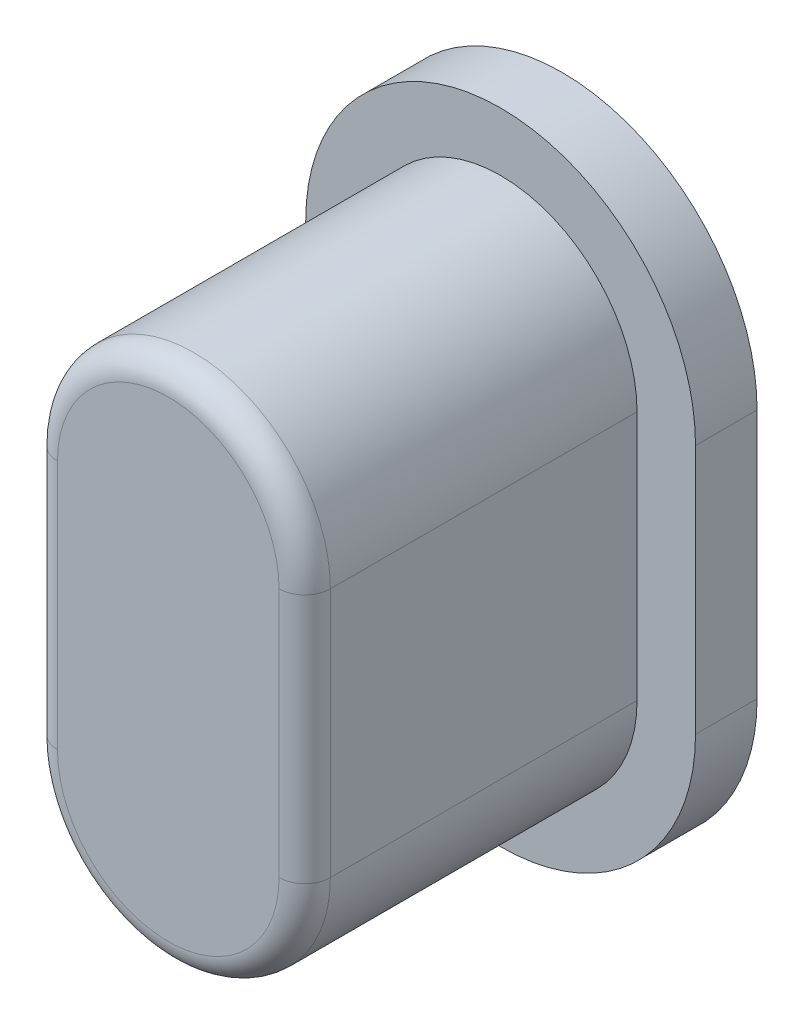
ISO-10303-21;
HEADER;
FILE_DESCRIPTION(('STEP AP214'),'2;1');
FILE_NAME('part.step','',(''),(''),'','','');
FILE_SCHEMA(('AUTOMOTIVE_DESIGN { 1 0 10303 214 1 1 1 1 }'));
ENDSEC;
DATA;
#1=APPLICATION_CONTEXT('core data for automotive mechanical design processes');
#2=APPLICATION_PROTOCOL_DEFINITION('international standard','automotive_design',2000,#1);
#3=PRODUCT_CONTEXT('',#1,'mechanical');
#4=PRODUCT('Part','Part','',(#3));
#5=PRODUCT_RELATED_PRODUCT_CATEGORY('part','',(#4));
#6=PRODUCT_DEFINITION_FORMATION('','',#4);
#7=PRODUCT_DEFINITION_CONTEXT('part definition',#1,'design');
#8=PRODUCT_DEFINITION('design','',#6,#7);
#9=PRODUCT_DEFINITION_SHAPE('','',#8);
#10=(LENGTH_UNIT() NAMED_UNIT(*) SI_UNIT(.MILLI.,.METRE.));
#11=(NAMED_UNIT(*) PLANE_ANGLE_UNIT() SI_UNIT($,.RADIAN.));
#12=(NAMED_UNIT(*) SI_UNIT($,.STERADIAN.) SOLID_ANGLE_UNIT());
#13=UNCERTAINTY_MEASURE_WITH_UNIT(LENGTH_MEASURE(1.E-05),#10,'distance_accuracy_value','');
#14=(GEOMETRIC_REPRESENTATION_CONTEXT(3) GLOBAL_UNCERTAINTY_ASSIGNED_CONTEXT((#13)) GLOBAL_UNIT_ASSIGNED_CONTEXT((#10,
#11,#12)) REPRESENTATION_CONTEXT('',''));
#15=CARTESIAN_POINT('',(0.,0.,0.));
#16=DIRECTION('',(0.,0.,1.));
#17=DIRECTION('',(1.,0.,0.));
#18=AXIS2_PLACEMENT_3D('',#15,#16,#17);
#19=CARTESIAN_POINT('',(0.,-2.43766,1.2));
#20=DIRECTION('',(0.,0.,1.));
#21=DIRECTION('',(1.,0.,0.));
#22=AXIS2_PLACEMENT_3D('',#19,#20,#21);
#23=PLANE('',#22);
#24=CARTESIAN_POINT('',(0.,-2.43766,1.2));
#25=DIRECTION('',(0.,0.,1.));
#26=DIRECTION('',(1.,0.,0.));
#27=AXIS2_PLACEMENT_3D('',#24,#25,#26);
#28=CIRCLE('',#27,3.8);
#29=CARTESIAN_POINT('',(-3.8,-2.43766,1.2));
#30=VERTEX_POINT('',#29);
#31=CARTESIAN_POINT('',(3.8,-2.43766,1.2));
#32=VERTEX_POINT('',#31);
#33=EDGE_CURVE('E140',#30,#32,#28,.T.);
#34=ORIENTED_EDGE('',*,*,#33,.T.);
#35=DIRECTION('',(0.,1.,0.));
#36=VECTOR('',#35,1.);
#37=CARTESIAN_POINT('',(3.8,-2.43766,1.2));
#38=LINE('',#37,#36);
#39=CARTESIAN_POINT('',(3.8,2.43766,1.2));
#40=VERTEX_POINT('',#39);
#41=EDGE_CURVE('E143',#32,#40,#38,.T.);
#42=ORIENTED_EDGE('',*,*,#41,.T.);
#43=CARTESIAN_POINT('',(0.,2.43766,1.2));
#44=DIRECTION('',(0.,0.,1.));
#45=DIRECTION('',(1.,0.,0.));
#46=AXIS2_PLACEMENT_3D('',#43,#44,#45);
#47=CIRCLE('',#46,3.8);
#48=CARTESIAN_POINT('',(-3.8,2.43766,1.2));
#49=VERTEX_POINT('',#48);
#50=EDGE_CURVE('E146',#40,#49,#47,.T.);
#51=ORIENTED_EDGE('',*,*,#50,.T.);
#52=DIRECTION('',(0.,-1.,0.));
#53=VECTOR('',#52,1.);
#54=CARTESIAN_POINT('',(-3.8,-2.43766,1.2));
#55=LINE('',#54,#53);
#56=EDGE_CURVE('E148',#49,#30,#55,.T.);
#57=ORIENTED_EDGE('',*,*,#56,.T.);
#58=EDGE_LOOP('',(#34,#42,#51,#57));
#59=FACE_BOUND('',#58,.T.);
#60=DIRECTION('',(0.,1.,0.));
#61=VECTOR('',#60,1.);
#62=CARTESIAN_POINT('',(2.66,-2.43766,1.2));
#63=LINE('',#62,#61);
#64=CARTESIAN_POINT('',(2.66,-2.43766,1.2));
#65=VERTEX_POINT('',#64);
#66=CARTESIAN_POINT('',(2.66,2.43766,1.2));
#67=VERTEX_POINT('',#66);
#68=EDGE_CURVE('E113',#65,#67,#63,.T.);
#69=ORIENTED_EDGE('',*,*,#68,.F.);
#70=CARTESIAN_POINT('',(0.,-2.43766,1.2));
#71=DIRECTION('',(0.,0.,1.));
#72=DIRECTION('',(1.,0.,0.));
#73=AXIS2_PLACEMENT_3D('',#70,#71,#72);
#74=CIRCLE('',#73,2.66);
#75=CARTESIAN_POINT('',(-2.66,-2.43766,1.2));
#76=VERTEX_POINT('',#75);
#77=EDGE_CURVE('E121',#76,#65,#74,.T.);
#78=ORIENTED_EDGE('',*,*,#77,.F.);
#79=DIRECTION('',(0.,-1.,0.));
#80=VECTOR('',#79,1.);
#81=CARTESIAN_POINT('',(-2.66,2.43766,1.2));
#82=LINE('',#81,#80);
#83=CARTESIAN_POINT('',(-2.66,2.43766,1.2));
#84=VERTEX_POINT('',#83);
#85=EDGE_CURVE('E132',#84,#76,#82,.T.);
#86=ORIENTED_EDGE('',*,*,#85,.F.);
#87=CARTESIAN_POINT('',(0.,2.43766,1.2));
#88=DIRECTION('',(0.,0.,1.));
#89=DIRECTION('',(1.,0.,0.));
#90=AXIS2_PLACEMENT_3D('',#87,#88,#89);
#91=CIRCLE('',#90,2.66);
#92=EDGE_CURVE('E130',#67,#84,#91,.T.);
#93=ORIENTED_EDGE('',*,*,#92,.F.);
#94=EDGE_LOOP('',(#69,#78,#86,#93));
#95=FACE_BOUND('',#94,.T.);
#96=ADVANCED_FACE('F33',(#59,#95),#23,.T.);
#97=CARTESIAN_POINT('',(0.,-2.43766,1.2));
#98=DIRECTION('',(0.,0.,-1.));
#99=DIRECTION('',(-1.,0.,0.));
#100=AXIS2_PLACEMENT_3D('',#97,#98,#99);
#101=CYLINDRICAL_SURFACE('',#100,3.8);
#102=CARTESIAN_POINT('',(0.,-2.43766,0.));
#103=DIRECTION('',(0.,0.,1.));
#104=DIRECTION('',(1.,0.,0.));
#105=AXIS2_PLACEMENT_3D('',#102,#103,#104);
#106=CIRCLE('',#105,3.8);
#107=CARTESIAN_POINT('',(-3.8,-2.43766,0.));
#108=VERTEX_POINT('',#107);
#109=CARTESIAN_POINT('',(3.8,-2.43766,0.));
#110=VERTEX_POINT('',#109);
#111=EDGE_CURVE('E117',#108,#110,#106,.T.);
#112=ORIENTED_EDGE('',*,*,#111,.T.);
#113=DIRECTION('',(0.,0.,-1.));
#114=VECTOR('',#113,1.);
#115=CARTESIAN_POINT('',(3.8,-2.43766,1.2));
#116=LINE('',#115,#114);
#117=EDGE_CURVE('E166',#32,#110,#116,.T.);
#118=ORIENTED_EDGE('',*,*,#117,.F.);
#119=ORIENTED_EDGE('',*,*,#33,.F.);
#120=DIRECTION('',(0.,0.,-1.));
#121=VECTOR('',#120,1.);
#122=CARTESIAN_POINT('',(-3.8,-2.43766,1.2));
#123=LINE('',#122,#121);
#124=EDGE_CURVE('E150',#30,#108,#123,.T.);
#125=ORIENTED_EDGE('',*,*,#124,.T.);
#126=EDGE_LOOP('',(#112,#118,#119,#125));
#127=FACE_BOUND('',#126,.T.);
#128=ADVANCED_FACE('F218',(#127),#101,.T.);
#129=CARTESIAN_POINT('',(3.8,-2.43766,1.2));
#130=DIRECTION('',(-1.,0.,0.));
#131=DIRECTION('',(0.,-1.,0.));
#132=AXIS2_PLACEMENT_3D('',#129,#130,#131);
#133=PLANE('',#132);
#134=DIRECTION('',(0.,1.,0.));
#135=VECTOR('',#134,1.);
#136=CARTESIAN_POINT('',(3.8,-2.43766,0.));
#137=LINE('',#136,#135);
#138=CARTESIAN_POINT('',(3.8,2.43766,0.));
#139=VERTEX_POINT('',#138);
#140=EDGE_CURVE('E153',#110,#139,#137,.T.);
#141=ORIENTED_EDGE('',*,*,#140,.T.);
#142=DIRECTION('',(0.,0.,-1.));
#143=VECTOR('',#142,1.);
#144=CARTESIAN_POINT('',(3.8,2.43766,1.2));
#145=LINE('',#144,#143);
#146=EDGE_CURVE('E163',#40,#139,#145,.T.);
#147=ORIENTED_EDGE('',*,*,#146,.F.);
#148=ORIENTED_EDGE('',*,*,#41,.F.);
#149=ORIENTED_EDGE('',*,*,#117,.T.);
#150=EDGE_LOOP('',(#141,#147,#148,#149));
#151=FACE_BOUND('',#150,.T.);
#152=ADVANCED_FACE('F224',(#151),#133,.F.);
#153=CARTESIAN_POINT('',(0.,2.43766,1.2));
#154=DIRECTION('',(0.,0.,-1.));
#155=DIRECTION('',(-1.,0.,0.));
#156=AXIS2_PLACEMENT_3D('',#153,#154,#155);
#157=CYLINDRICAL_SURFACE('',#156,3.8);
#158=CARTESIAN_POINT('',(0.,2.43766,0.));
#159=DIRECTION('',(0.,0.,1.));
#160=DIRECTION('',(1.,0.,0.));
#161=AXIS2_PLACEMENT_3D('',#158,#159,#160);
#162=CIRCLE('',#161,3.8);
#163=CARTESIAN_POINT('',(-3.8,2.43766,0.));
#164=VERTEX_POINT('',#163);
#165=EDGE_CURVE('E155',#139,#164,#162,.T.);
#166=ORIENTED_EDGE('',*,*,#165,.T.);
#167=DIRECTION('',(0.,0.,-1.));
#168=VECTOR('',#167,1.);
#169=CARTESIAN_POINT('',(-3.8,2.43766,1.2));
#170=LINE('',#169,#168);
#171=EDGE_CURVE('E160',#49,#164,#170,.T.);
#172=ORIENTED_EDGE('',*,*,#171,.F.);
#173=ORIENTED_EDGE('',*,*,#50,.F.);
#174=ORIENTED_EDGE('',*,*,#146,.T.);
#175=EDGE_LOOP('',(#166,#172,#173,#174));
#176=FACE_BOUND('',#175,.T.);
#177=ADVANCED_FACE('F237',(#176),#157,.T.);
#178=CARTESIAN_POINT('',(-3.8,-2.43766,1.2));
#179=DIRECTION('',(1.,0.,0.));
#180=DIRECTION('',(0.,1.,0.));
#181=AXIS2_PLACEMENT_3D('',#178,#179,#180);
#182=PLANE('',#181);
#183=DIRECTION('',(0.,-1.,0.));
#184=VECTOR('',#183,1.);
#185=CARTESIAN_POINT('',(-3.8,-2.43766,0.));
#186=LINE('',#185,#184);
#187=EDGE_CURVE('E144',#164,#108,#186,.T.);
#188=ORIENTED_EDGE('',*,*,#187,.T.);
#189=ORIENTED_EDGE('',*,*,#124,.F.);
#190=ORIENTED_EDGE('',*,*,#56,.F.);
#191=ORIENTED_EDGE('',*,*,#171,.T.);
#192=EDGE_LOOP('',(#188,#189,#190,#191));
#193=FACE_BOUND('',#192,.T.);
#194=ADVANCED_FACE('F233',(#193),#182,.F.);
#195=CARTESIAN_POINT('',(0.,-2.43766,0.));
#196=DIRECTION('',(0.,0.,1.));
#197=DIRECTION('',(1.,0.,0.));
#198=AXIS2_PLACEMENT_3D('',#195,#196,#197);
#199=PLANE('',#198);
#200=ORIENTED_EDGE('',*,*,#111,.F.);
#201=ORIENTED_EDGE('',*,*,#187,.F.);
#202=ORIENTED_EDGE('',*,*,#165,.F.);
#203=ORIENTED_EDGE('',*,*,#140,.F.);
#204=EDGE_LOOP('',(#200,#201,#202,#203));
#205=FACE_BOUND('',#204,.T.);
#206=ADVANCED_FACE('F230',(#205),#199,.F.);
#207=CARTESIAN_POINT('',(0.,-2.43766,7.68));
#208=DIRECTION('',(0.,0.,-1.));
#209=DIRECTION('',(-1.,0.,0.));
#210=AXIS2_PLACEMENT_3D('',#207,#208,#209);
#211=CYLINDRICAL_SURFACE('',#210,2.66);
#212=DIRECTION('',(0.,0.,-1.));
#213=VECTOR('',#212,1.);
#214=CARTESIAN_POINT('',(2.66,-2.43766,7.68));
#215=LINE('',#214,#213);
#216=CARTESIAN_POINT('',(2.66,-2.43766,7.18));
#217=VERTEX_POINT('',#216);
#218=EDGE_CURVE('E109',#217,#65,#215,.T.);
#219=ORIENTED_EDGE('',*,*,#218,.F.);
#220=CARTESIAN_POINT('',(0.,-2.43766,7.18));
#221=DIRECTION('',(0.,0.,1.));
#222=DIRECTION('',(1.,0.,0.));
#223=AXIS2_PLACEMENT_3D('',#220,#221,#222);
#224=CIRCLE('',#223,2.66);
#225=CARTESIAN_POINT('',(-2.66,-2.43766,7.18));
#226=VERTEX_POINT('',#225);
#227=EDGE_CURVE('E11',#217,#226,#224,.F.);
#228=ORIENTED_EDGE('',*,*,#227,.T.);
#229=DIRECTION('',(0.,0.,-1.));
#230=VECTOR('',#229,1.);
#231=CARTESIAN_POINT('',(-2.66,-2.43766,7.68));
#232=LINE('',#231,#230);
#233=EDGE_CURVE('E124',#226,#76,#232,.T.);
#234=ORIENTED_EDGE('',*,*,#233,.T.);
#235=ORIENTED_EDGE('',*,*,#77,.T.);
#236=EDGE_LOOP('',(#219,#228,#234,#235));
#237=FACE_BOUND('',#236,.T.);
#238=ADVANCED_FACE('F122',(#237),#211,.T.);
#239=CARTESIAN_POINT('',(2.66,-2.43766,7.68));
#240=DIRECTION('',(-1.,0.,0.));
#241=DIRECTION('',(0.,0.,1.));
#242=AXIS2_PLACEMENT_3D('',#239,#240,#241);
#243=PLANE('',#242);
#244=DIRECTION('',(0.,0.,-1.));
#245=VECTOR('',#244,1.);
#246=CARTESIAN_POINT('',(2.66,2.43766,7.68));
#247=LINE('',#246,#245);
#248=CARTESIAN_POINT('',(2.66,2.43766,7.18));
#249=VERTEX_POINT('',#248);
#250=EDGE_CURVE('E118',#249,#67,#247,.T.);
#251=ORIENTED_EDGE('',*,*,#250,.F.);
#252=DIRECTION('',(0.,1.,0.));
#253=VECTOR('',#252,1.);
#254=CARTESIAN_POINT('',(2.66,-2.43766,7.18));
#255=LINE('',#254,#253);
#256=EDGE_CURVE('E42',#249,#217,#255,.F.);
#257=ORIENTED_EDGE('',*,*,#256,.T.);
#258=ORIENTED_EDGE('',*,*,#218,.T.);
#259=ORIENTED_EDGE('',*,*,#68,.T.);
#260=EDGE_LOOP('',(#251,#257,#258,#259));
#261=FACE_BOUND('',#260,.T.);
#262=ADVANCED_FACE('F111',(#261),#243,.F.);
#263=CARTESIAN_POINT('',(0.,2.43766,7.68));
#264=DIRECTION('',(0.,0.,-1.));
#265=DIRECTION('',(-1.,0.,0.));
#266=AXIS2_PLACEMENT_3D('',#263,#264,#265);
#267=CYLINDRICAL_SURFACE('',#266,2.66);
#268=DIRECTION('',(0.,0.,-1.));
#269=VECTOR('',#268,1.);
#270=CARTESIAN_POINT('',(-2.66,2.43766,7.68));
#271=LINE('',#270,#269);
#272=CARTESIAN_POINT('',(-2.66,2.43766,7.18));
#273=VERTEX_POINT('',#272);
#274=EDGE_CURVE('E137',#273,#84,#271,.T.);
#275=ORIENTED_EDGE('',*,*,#274,.F.);
#276=CARTESIAN_POINT('',(0.,2.43766,7.18));
#277=DIRECTION('',(0.,0.,1.));
#278=DIRECTION('',(1.,0.,0.));
#279=AXIS2_PLACEMENT_3D('',#276,#277,#278);
#280=CIRCLE('',#279,2.66);
#281=EDGE_CURVE('E57',#273,#249,#280,.F.);
#282=ORIENTED_EDGE('',*,*,#281,.T.);
#283=ORIENTED_EDGE('',*,*,#250,.T.);
#284=ORIENTED_EDGE('',*,*,#92,.T.);
#285=EDGE_LOOP('',(#275,#282,#283,#284));
#286=FACE_BOUND('',#285,.T.);
#287=ADVANCED_FACE('F215',(#286),#267,.T.);
#288=CARTESIAN_POINT('',(-2.66,2.43766,7.68));
#289=DIRECTION('',(1.,0.,0.));
#290=DIRECTION('',(0.,1.,0.));
#291=AXIS2_PLACEMENT_3D('',#288,#289,#290);
#292=PLANE('',#291);
#293=ORIENTED_EDGE('',*,*,#233,.F.);
#294=DIRECTION('',(0.,-1.,0.));
#295=VECTOR('',#294,1.);
#296=CARTESIAN_POINT('',(-2.66,2.43766,7.18));
#297=LINE('',#296,#295);
#298=EDGE_CURVE('E178',#226,#273,#297,.F.);
#299=ORIENTED_EDGE('',*,*,#298,.T.);
#300=ORIENTED_EDGE('',*,*,#274,.T.);
#301=ORIENTED_EDGE('',*,*,#85,.T.);
#302=EDGE_LOOP('',(#293,#299,#300,#301));
#303=FACE_BOUND('',#302,.T.);
#304=ADVANCED_FACE('F203',(#303),#292,.F.);
#305=CARTESIAN_POINT('',(0.,-2.43766,7.68));
#306=DIRECTION('',(0.,0.,1.));
#307=DIRECTION('',(1.,0.,0.));
#308=AXIS2_PLACEMENT_3D('',#305,#306,#307);
#309=PLANE('',#308);
#310=CARTESIAN_POINT('',(0.,2.43766,7.68));
#311=DIRECTION('',(0.,0.,1.));
#312=DIRECTION('',(1.,0.,0.));
#313=AXIS2_PLACEMENT_3D('',#310,#311,#312);
#314=CIRCLE('',#313,2.16);
#315=CARTESIAN_POINT('',(2.16,2.43766,7.68));
#316=VERTEX_POINT('',#315);
#317=CARTESIAN_POINT('',(-2.16,2.43766,7.68));
#318=VERTEX_POINT('',#317);
#319=EDGE_CURVE('E173',#316,#318,#314,.T.);
#320=ORIENTED_EDGE('',*,*,#319,.T.);
#321=DIRECTION('',(0.,-1.,0.));
#322=VECTOR('',#321,1.);
#323=CARTESIAN_POINT('',(-2.16,-2.43766,7.68));
#324=LINE('',#323,#322);
#325=CARTESIAN_POINT('',(-2.16,-2.43766,7.68));
#326=VERTEX_POINT('',#325);
#327=EDGE_CURVE('E175',#318,#326,#324,.T.);
#328=ORIENTED_EDGE('',*,*,#327,.T.);
#329=CARTESIAN_POINT('',(0.,-2.43766,7.68));
#330=DIRECTION('',(0.,0.,1.));
#331=DIRECTION('',(1.,0.,0.));
#332=AXIS2_PLACEMENT_3D('',#329,#330,#331);
#333=CIRCLE('',#332,2.16);
#334=CARTESIAN_POINT('',(2.16,-2.43766,7.68));
#335=VERTEX_POINT('',#334);
#336=EDGE_CURVE('E169',#326,#335,#333,.T.);
#337=ORIENTED_EDGE('',*,*,#336,.T.);
#338=DIRECTION('',(0.,1.,0.));
#339=VECTOR('',#338,1.);
#340=CARTESIAN_POINT('',(2.16,2.43766,7.68));
#341=LINE('',#340,#339);
#342=EDGE_CURVE('E171',#335,#316,#341,.T.);
#343=ORIENTED_EDGE('',*,*,#342,.T.);
#344=EDGE_LOOP('',(#320,#328,#337,#343));
#345=FACE_BOUND('',#344,.T.);
#346=ADVANCED_FACE('F208',(#345),#309,.T.);
#347=CARTESIAN_POINT('',(2.16,-2.43766,7.18));
#348=DIRECTION('',(0.,-1.,0.));
#349=DIRECTION('',(0.,0.,-1.));
#350=AXIS2_PLACEMENT_3D('',#347,#348,#349);
#351=CYLINDRICAL_SURFACE('',#350,0.5);
#352=CARTESIAN_POINT('',(2.16,-2.43766,7.18));
#353=DIRECTION('',(0.,-1.,0.));
#354=DIRECTION('',(0.,0.,-1.));
#355=AXIS2_PLACEMENT_3D('',#352,#353,#354);
#356=CIRCLE('',#355,0.5);
#357=EDGE_CURVE('E186',#217,#335,#356,.T.);
#358=ORIENTED_EDGE('',*,*,#357,.F.);
#359=ORIENTED_EDGE('',*,*,#256,.F.);
#360=CARTESIAN_POINT('',(2.16,2.43766,7.18));
#361=DIRECTION('',(0.,1.,0.));
#362=DIRECTION('',(-1.,0.,0.));
#363=AXIS2_PLACEMENT_3D('',#360,#361,#362);
#364=CIRCLE('',#363,0.5);
#365=EDGE_CURVE('E37',#316,#249,#364,.T.);
#366=ORIENTED_EDGE('',*,*,#365,.F.);
#367=ORIENTED_EDGE('',*,*,#342,.F.);
#368=EDGE_LOOP('',(#358,#359,#366,#367));
#369=FACE_BOUND('',#368,.T.);
#370=ADVANCED_FACE('F35',(#369),#351,.T.);
#371=CARTESIAN_POINT('',(0.,2.43766,7.18));
#372=DIRECTION('',(0.,0.,1.));
#373=DIRECTION('',(1.,0.,0.));
#374=AXIS2_PLACEMENT_3D('',#371,#372,#373);
#375=TOROIDAL_SURFACE('',#374,2.16,0.5);
#376=ORIENTED_EDGE('',*,*,#365,.T.);
#377=ORIENTED_EDGE('',*,*,#281,.F.);
#378=CARTESIAN_POINT('',(-2.16,2.43766,7.18));
#379=DIRECTION('',(0.,-1.,0.));
#380=DIRECTION('',(0.,0.,-1.));
#381=AXIS2_PLACEMENT_3D('',#378,#379,#380);
#382=CIRCLE('',#381,0.5);
#383=EDGE_CURVE('E185',#318,#273,#382,.T.);
#384=ORIENTED_EDGE('',*,*,#383,.F.);
#385=ORIENTED_EDGE('',*,*,#319,.F.);
#386=EDGE_LOOP('',(#376,#377,#384,#385));
#387=FACE_BOUND('',#386,.T.);
#388=ADVANCED_FACE('F195',(#387),#375,.T.);
#389=CARTESIAN_POINT('',(0.,-2.43766,7.18));
#390=DIRECTION('',(0.,0.,1.));
#391=DIRECTION('',(1.,0.,0.));
#392=AXIS2_PLACEMENT_3D('',#389,#390,#391);
#393=TOROIDAL_SURFACE('',#392,2.16,0.5);
#394=ORIENTED_EDGE('',*,*,#357,.T.);
#395=ORIENTED_EDGE('',*,*,#336,.F.);
#396=CARTESIAN_POINT('',(-2.16,-2.43766,7.18));
#397=DIRECTION('',(0.,1.,0.));
#398=DIRECTION('',(0.,0.,1.));
#399=AXIS2_PLACEMENT_3D('',#396,#397,#398);
#400=CIRCLE('',#399,0.5);
#401=EDGE_CURVE('E183',#226,#326,#400,.T.);
#402=ORIENTED_EDGE('',*,*,#401,.F.);
#403=ORIENTED_EDGE('',*,*,#227,.F.);
#404=EDGE_LOOP('',(#394,#395,#402,#403));
#405=FACE_BOUND('',#404,.T.);
#406=ADVANCED_FACE('F200',(#405),#393,.T.);
#407=CARTESIAN_POINT('',(-2.16,-2.43766,7.18));
#408=DIRECTION('',(0.,1.,0.));
#409=DIRECTION('',(-1.,0.,0.));
#410=AXIS2_PLACEMENT_3D('',#407,#408,#409);
#411=CYLINDRICAL_SURFACE('',#410,0.5);
#412=ORIENTED_EDGE('',*,*,#383,.T.);
#413=ORIENTED_EDGE('',*,*,#298,.F.);
#414=ORIENTED_EDGE('',*,*,#401,.T.);
#415=ORIENTED_EDGE('',*,*,#327,.F.);
#416=EDGE_LOOP('',(#412,#413,#414,#415));
#417=FACE_BOUND('',#416,.T.);
#418=ADVANCED_FACE('F205',(#417),#411,.T.);
#419=CLOSED_SHELL('',(#96,#128,#152,#177,#194,#206,#238,#262,#287,#304,#346,#370,#388,#406,#418));
#420=MANIFOLD_SOLID_BREP('B2',#419);
#421=ADVANCED_BREP_SHAPE_REPRESENTATION('',(#18,#420),#14);
#422=SHAPE_DEFINITION_REPRESENTATION(#9,#421);
ENDSEC;
END-ISO-10303-21;
